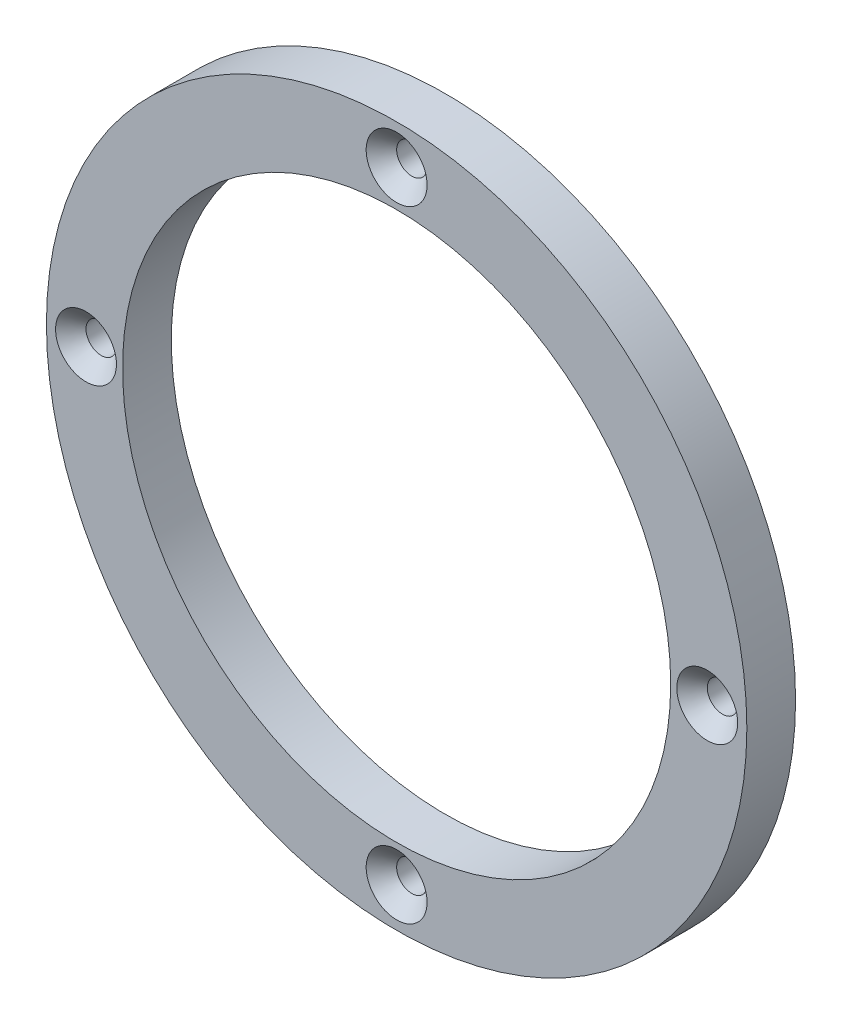
ISO-10303-21;
HEADER;
FILE_DESCRIPTION(('STEP AP214'),'2;1');
FILE_NAME('part.step','',(''),(''),'','','');
FILE_SCHEMA(('AUTOMOTIVE_DESIGN { 1 0 10303 214 1 1 1 1 }'));
ENDSEC;
DATA;
#1=APPLICATION_CONTEXT('core data for automotive mechanical design processes');
#2=APPLICATION_PROTOCOL_DEFINITION('international standard','automotive_design',2000,#1);
#3=PRODUCT_CONTEXT('',#1,'mechanical');
#4=PRODUCT('Part','Part','',(#3));
#5=PRODUCT_RELATED_PRODUCT_CATEGORY('part','',(#4));
#6=PRODUCT_DEFINITION_FORMATION('','',#4);
#7=PRODUCT_DEFINITION_CONTEXT('part definition',#1,'design');
#8=PRODUCT_DEFINITION('design','',#6,#7);
#9=PRODUCT_DEFINITION_SHAPE('','',#8);
#10=(LENGTH_UNIT() NAMED_UNIT(*) SI_UNIT(.MILLI.,.METRE.));
#11=(NAMED_UNIT(*) PLANE_ANGLE_UNIT() SI_UNIT($,.RADIAN.));
#12=(NAMED_UNIT(*) SI_UNIT($,.STERADIAN.) SOLID_ANGLE_UNIT());
#13=UNCERTAINTY_MEASURE_WITH_UNIT(LENGTH_MEASURE(1.E-05),#10,'distance_accuracy_value','');
#14=(GEOMETRIC_REPRESENTATION_CONTEXT(3) GLOBAL_UNCERTAINTY_ASSIGNED_CONTEXT((#13)) GLOBAL_UNIT_ASSIGNED_CONTEXT((#10,
#11,#12)) REPRESENTATION_CONTEXT('',''));
#15=CARTESIAN_POINT('',(0.,0.,0.));
#16=DIRECTION('',(0.,0.,1.));
#17=DIRECTION('',(1.,0.,0.));
#18=AXIS2_PLACEMENT_3D('',#15,#16,#17);
#19=CARTESIAN_POINT('',(0.,0.,8.));
#20=DIRECTION('',(0.,0.,1.));
#21=DIRECTION('',(1.,0.,0.));
#22=AXIS2_PLACEMENT_3D('',#19,#20,#21);
#23=PLANE('',#22);
#24=CARTESIAN_POINT('',(0.,0.,8.));
#25=DIRECTION('',(0.,0.,1.));
#26=DIRECTION('',(1.,0.,0.));
#27=AXIS2_PLACEMENT_3D('',#24,#25,#26);
#28=CIRCLE('',#27,45.);
#29=CARTESIAN_POINT('',(45.,0.,8.));
#30=VERTEX_POINT('',#29);
#31=EDGE_CURVE('E45',#30,#30,#28,.F.);
#32=ORIENTED_EDGE('',*,*,#31,.T.);
#33=EDGE_LOOP('',(#32));
#34=FACE_BOUND('',#33,.T.);
#35=CARTESIAN_POINT('',(0.,51.0000007599592,7.99999999998136));
#36=DIRECTION('',(0.,0.,1.));
#37=DIRECTION('',(1.,0.,0.));
#38=AXIS2_PLACEMENT_3D('',#35,#36,#37);
#39=CIRCLE('',#38,4.99999999999545);
#40=CARTESIAN_POINT('',(4.99999999999545,51.0000007599592,7.99999999998136));
#41=VERTEX_POINT('',#40);
#42=EDGE_CURVE('E18',#41,#41,#39,.F.);
#43=ORIENTED_EDGE('',*,*,#42,.T.);
#44=EDGE_LOOP('',(#43));
#45=FACE_BOUND('',#44,.T.);
#46=CARTESIAN_POINT('',(-51.0000007599592,0.,8.00000000000638));
#47=DIRECTION('',(0.,0.,1.));
#48=DIRECTION('',(1.,0.,0.));
#49=AXIS2_PLACEMENT_3D('',#46,#47,#48);
#50=CIRCLE('',#49,4.99999999999545);
#51=CARTESIAN_POINT('',(-46.0000007599638,0.,8.00000000000638));
#52=VERTEX_POINT('',#51);
#53=EDGE_CURVE('E56',#52,#52,#50,.F.);
#54=ORIENTED_EDGE('',*,*,#53,.T.);
#55=EDGE_LOOP('',(#54));
#56=FACE_BOUND('',#55,.T.);
#57=CARTESIAN_POINT('',(51.0000007599592,0.,8.00000000001317));
#58=DIRECTION('',(0.,0.,1.));
#59=DIRECTION('',(1.,0.,0.));
#60=AXIS2_PLACEMENT_3D('',#57,#58,#59);
#61=CIRCLE('',#60,4.99999999999545);
#62=CARTESIAN_POINT('',(56.0000007599547,0.,8.00000000001317));
#63=VERTEX_POINT('',#62);
#64=EDGE_CURVE('E51',#63,#63,#61,.F.);
#65=ORIENTED_EDGE('',*,*,#64,.T.);
#66=EDGE_LOOP('',(#65));
#67=FACE_BOUND('',#66,.T.);
#68=CARTESIAN_POINT('',(0.,-51.0000007599592,7.99999999998135));
#69=DIRECTION('',(0.,0.,1.));
#70=DIRECTION('',(1.,0.,0.));
#71=AXIS2_PLACEMENT_3D('',#68,#69,#70);
#72=CIRCLE('',#71,4.99999999999545);
#73=CARTESIAN_POINT('',(4.99999999999545,-51.0000007599592,7.99999999998135));
#74=VERTEX_POINT('',#73);
#75=EDGE_CURVE('E54',#74,#74,#72,.F.);
#76=ORIENTED_EDGE('',*,*,#75,.T.);
#77=EDGE_LOOP('',(#76));
#78=FACE_BOUND('',#77,.T.);
#79=CARTESIAN_POINT('',(0.,0.,8.));
#80=DIRECTION('',(0.,0.,1.));
#81=DIRECTION('',(1.,0.,0.));
#82=AXIS2_PLACEMENT_3D('',#79,#80,#81);
#83=CIRCLE('',#82,57.5);
#84=CARTESIAN_POINT('',(57.5,0.,8.));
#85=VERTEX_POINT('',#84);
#86=EDGE_CURVE('E48',#85,#85,#83,.F.);
#87=ORIENTED_EDGE('',*,*,#86,.F.);
#88=EDGE_LOOP('',(#87));
#89=FACE_BOUND('',#88,.T.);
#90=ADVANCED_FACE('F15',(#34,#45,#56,#67,#78,#89),#23,.T.);
#91=CARTESIAN_POINT('',(0.,51.0000007599592,7.99999999998136));
#92=DIRECTION('',(0.,0.,1.));
#93=DIRECTION('',(1.,0.,0.));
#94=AXIS2_PLACEMENT_3D('',#91,#92,#93);
#95=CONICAL_SURFACE('',#94,4.99999999999545,0.785398163397448);
#96=CARTESIAN_POINT('',(0.,51.0000007599592,5.5));
#97=DIRECTION('',(0.,0.,1.));
#98=DIRECTION('',(1.,0.,0.));
#99=AXIS2_PLACEMENT_3D('',#96,#97,#98);
#100=CIRCLE('',#99,2.5);
#101=CARTESIAN_POINT('',(2.5,51.0000007599592,5.5));
#102=VERTEX_POINT('',#101);
#103=EDGE_CURVE('E30',#102,#102,#100,.F.);
#104=ORIENTED_EDGE('',*,*,#103,.T.);
#105=EDGE_LOOP('',(#104));
#106=FACE_BOUND('',#105,.T.);
#107=ORIENTED_EDGE('',*,*,#42,.F.);
#108=EDGE_LOOP('',(#107));
#109=FACE_BOUND('',#108,.T.);
#110=ADVANCED_FACE('F64',(#106,#109),#95,.F.);
#111=CARTESIAN_POINT('',(-51.0000007599592,0.,8.0000000000382));
#112=DIRECTION('',(0.,0.,1.));
#113=DIRECTION('',(1.,0.,0.));
#114=AXIS2_PLACEMENT_3D('',#111,#112,#113);
#115=CONICAL_SURFACE('',#114,5.00000000002727,0.785398163397448);
#116=CARTESIAN_POINT('',(-51.0000007599592,0.,5.5));
#117=DIRECTION('',(0.,0.,1.));
#118=DIRECTION('',(1.,0.,0.));
#119=AXIS2_PLACEMENT_3D('',#116,#117,#118);
#120=CIRCLE('',#119,2.5);
#121=CARTESIAN_POINT('',(-48.5000007599592,0.,5.5));
#122=VERTEX_POINT('',#121);
#123=EDGE_CURVE('E127',#122,#122,#120,.F.);
#124=ORIENTED_EDGE('',*,*,#123,.T.);
#125=EDGE_LOOP('',(#124));
#126=FACE_BOUND('',#125,.T.);
#127=ORIENTED_EDGE('',*,*,#53,.F.);
#128=EDGE_LOOP('',(#127));
#129=FACE_BOUND('',#128,.T.);
#130=ADVANCED_FACE('F66',(#126,#129),#115,.F.);
#131=CARTESIAN_POINT('',(0.,-51.0000007599592,7.99999999998136));
#132=DIRECTION('',(0.,0.,1.));
#133=DIRECTION('',(1.,0.,0.));
#134=AXIS2_PLACEMENT_3D('',#131,#132,#133);
#135=CONICAL_SURFACE('',#134,4.99999999999546,0.785398163397448);
#136=CARTESIAN_POINT('',(0.,-51.0000007599592,5.5));
#137=DIRECTION('',(0.,0.,1.));
#138=DIRECTION('',(1.,0.,0.));
#139=AXIS2_PLACEMENT_3D('',#136,#137,#138);
#140=CIRCLE('',#139,2.5);
#141=CARTESIAN_POINT('',(2.49999999999999,-51.0000007599592,5.5));
#142=VERTEX_POINT('',#141);
#143=EDGE_CURVE('E120',#142,#142,#140,.F.);
#144=ORIENTED_EDGE('',*,*,#143,.T.);
#145=EDGE_LOOP('',(#144));
#146=FACE_BOUND('',#145,.T.);
#147=ORIENTED_EDGE('',*,*,#75,.F.);
#148=EDGE_LOOP('',(#147));
#149=FACE_BOUND('',#148,.T.);
#150=ADVANCED_FACE('F73',(#146,#149),#135,.F.);
#151=CARTESIAN_POINT('',(51.0000007599592,0.,7.99999999998136));
#152=DIRECTION('',(0.,0.,1.));
#153=DIRECTION('',(1.,0.,0.));
#154=AXIS2_PLACEMENT_3D('',#151,#152,#153);
#155=CONICAL_SURFACE('',#154,4.99999999996364,0.785398163397448);
#156=CARTESIAN_POINT('',(51.0000007599592,0.,5.5));
#157=DIRECTION('',(0.,0.,1.));
#158=DIRECTION('',(1.,0.,0.));
#159=AXIS2_PLACEMENT_3D('',#156,#157,#158);
#160=CIRCLE('',#159,2.5);
#161=CARTESIAN_POINT('',(53.5000007599592,0.,5.5));
#162=VERTEX_POINT('',#161);
#163=EDGE_CURVE('E44',#162,#162,#160,.F.);
#164=ORIENTED_EDGE('',*,*,#163,.T.);
#165=EDGE_LOOP('',(#164));
#166=FACE_BOUND('',#165,.T.);
#167=ORIENTED_EDGE('',*,*,#64,.F.);
#168=EDGE_LOOP('',(#167));
#169=FACE_BOUND('',#168,.T.);
#170=ADVANCED_FACE('F108',(#166,#169),#155,.F.);
#171=CARTESIAN_POINT('',(0.,0.,0.));
#172=DIRECTION('',(0.,0.,1.));
#173=DIRECTION('',(1.,0.,0.));
#174=AXIS2_PLACEMENT_3D('',#171,#172,#173);
#175=CYLINDRICAL_SURFACE('',#174,57.5);
#176=CARTESIAN_POINT('',(0.,0.,0.));
#177=DIRECTION('',(0.,0.,1.));
#178=DIRECTION('',(1.,0.,0.));
#179=AXIS2_PLACEMENT_3D('',#176,#177,#178);
#180=CIRCLE('',#179,57.5);
#181=CARTESIAN_POINT('',(57.5,0.,0.));
#182=VERTEX_POINT('',#181);
#183=EDGE_CURVE('E41',#182,#182,#180,.T.);
#184=ORIENTED_EDGE('',*,*,#183,.T.);
#185=EDGE_LOOP('',(#184));
#186=FACE_BOUND('',#185,.T.);
#187=ORIENTED_EDGE('',*,*,#86,.T.);
#188=EDGE_LOOP('',(#187));
#189=FACE_BOUND('',#188,.T.);
#190=ADVANCED_FACE('F104',(#186,#189),#175,.T.);
#191=CARTESIAN_POINT('',(0.,0.,0.));
#192=DIRECTION('',(0.,0.,1.));
#193=DIRECTION('',(1.,0.,0.));
#194=AXIS2_PLACEMENT_3D('',#191,#192,#193);
#195=CYLINDRICAL_SURFACE('',#194,45.);
#196=CARTESIAN_POINT('',(0.,0.,0.));
#197=DIRECTION('',(0.,0.,1.));
#198=DIRECTION('',(1.,0.,0.));
#199=AXIS2_PLACEMENT_3D('',#196,#197,#198);
#200=CIRCLE('',#199,45.);
#201=CARTESIAN_POINT('',(45.,0.,0.));
#202=VERTEX_POINT('',#201);
#203=EDGE_CURVE('E38',#202,#202,#200,.F.);
#204=ORIENTED_EDGE('',*,*,#203,.T.);
#205=EDGE_LOOP('',(#204));
#206=FACE_BOUND('',#205,.T.);
#207=ORIENTED_EDGE('',*,*,#31,.F.);
#208=EDGE_LOOP('',(#207));
#209=FACE_BOUND('',#208,.T.);
#210=ADVANCED_FACE('F100',(#206,#209),#195,.F.);
#211=CARTESIAN_POINT('',(0.,51.0000007599592,0.));
#212=DIRECTION('',(0.,0.,1.));
#213=DIRECTION('',(1.,0.,0.));
#214=AXIS2_PLACEMENT_3D('',#211,#212,#213);
#215=CYLINDRICAL_SURFACE('',#214,2.5);
#216=CARTESIAN_POINT('',(0.,51.0000007599592,0.));
#217=DIRECTION('',(0.,0.,1.));
#218=DIRECTION('',(1.,0.,0.));
#219=AXIS2_PLACEMENT_3D('',#216,#217,#218);
#220=CIRCLE('',#219,2.5);
#221=CARTESIAN_POINT('',(2.5,51.0000007599592,0.));
#222=VERTEX_POINT('',#221);
#223=EDGE_CURVE('E35',#222,#222,#220,.F.);
#224=ORIENTED_EDGE('',*,*,#223,.T.);
#225=EDGE_LOOP('',(#224));
#226=FACE_BOUND('',#225,.T.);
#227=ORIENTED_EDGE('',*,*,#103,.F.);
#228=EDGE_LOOP('',(#227));
#229=FACE_BOUND('',#228,.T.);
#230=ADVANCED_FACE('F96',(#226,#229),#215,.F.);
#231=CARTESIAN_POINT('',(-51.0000007599592,0.,0.));
#232=DIRECTION('',(0.,0.,1.));
#233=DIRECTION('',(1.,0.,0.));
#234=AXIS2_PLACEMENT_3D('',#231,#232,#233);
#235=CYLINDRICAL_SURFACE('',#234,2.5);
#236=CARTESIAN_POINT('',(-51.0000007599592,0.,0.));
#237=DIRECTION('',(0.,0.,1.));
#238=DIRECTION('',(1.,0.,0.));
#239=AXIS2_PLACEMENT_3D('',#236,#237,#238);
#240=CIRCLE('',#239,2.5);
#241=CARTESIAN_POINT('',(-48.5000007599592,0.,0.));
#242=VERTEX_POINT('',#241);
#243=EDGE_CURVE('E27',#242,#242,#240,.F.);
#244=ORIENTED_EDGE('',*,*,#243,.T.);
#245=EDGE_LOOP('',(#244));
#246=FACE_BOUND('',#245,.T.);
#247=ORIENTED_EDGE('',*,*,#123,.F.);
#248=EDGE_LOOP('',(#247));
#249=FACE_BOUND('',#248,.T.);
#250=ADVANCED_FACE('F92',(#246,#249),#235,.F.);
#251=CARTESIAN_POINT('',(0.,-51.0000007599592,0.));
#252=DIRECTION('',(0.,0.,1.));
#253=DIRECTION('',(1.,0.,0.));
#254=AXIS2_PLACEMENT_3D('',#251,#252,#253);
#255=CYLINDRICAL_SURFACE('',#254,2.5);
#256=CARTESIAN_POINT('',(0.,-51.0000007599592,0.));
#257=DIRECTION('',(0.,0.,1.));
#258=DIRECTION('',(1.,0.,0.));
#259=AXIS2_PLACEMENT_3D('',#256,#257,#258);
#260=CIRCLE('',#259,2.5);
#261=CARTESIAN_POINT('',(2.49999999999999,-51.0000007599592,0.));
#262=VERTEX_POINT('',#261);
#263=EDGE_CURVE('E22',#262,#262,#260,.F.);
#264=ORIENTED_EDGE('',*,*,#263,.T.);
#265=EDGE_LOOP('',(#264));
#266=FACE_BOUND('',#265,.T.);
#267=ORIENTED_EDGE('',*,*,#143,.F.);
#268=EDGE_LOOP('',(#267));
#269=FACE_BOUND('',#268,.T.);
#270=ADVANCED_FACE('F86',(#266,#269),#255,.F.);
#271=CARTESIAN_POINT('',(51.0000007599592,0.,0.));
#272=DIRECTION('',(0.,0.,1.));
#273=DIRECTION('',(1.,0.,0.));
#274=AXIS2_PLACEMENT_3D('',#271,#272,#273);
#275=CYLINDRICAL_SURFACE('',#274,2.5);
#276=CARTESIAN_POINT('',(51.0000007599592,0.,0.));
#277=DIRECTION('',(0.,0.,1.));
#278=DIRECTION('',(1.,0.,0.));
#279=AXIS2_PLACEMENT_3D('',#276,#277,#278);
#280=CIRCLE('',#279,2.5);
#281=CARTESIAN_POINT('',(53.5000007599592,0.,0.));
#282=VERTEX_POINT('',#281);
#283=EDGE_CURVE('E10',#282,#282,#280,.F.);
#284=ORIENTED_EDGE('',*,*,#283,.T.);
#285=EDGE_LOOP('',(#284));
#286=FACE_BOUND('',#285,.T.);
#287=ORIENTED_EDGE('',*,*,#163,.F.);
#288=EDGE_LOOP('',(#287));
#289=FACE_BOUND('',#288,.T.);
#290=ADVANCED_FACE('F80',(#286,#289),#275,.F.);
#291=CARTESIAN_POINT('',(0.,0.,0.));
#292=DIRECTION('',(0.,0.,1.));
#293=DIRECTION('',(1.,0.,0.));
#294=AXIS2_PLACEMENT_3D('',#291,#292,#293);
#295=PLANE('',#294);
#296=ORIENTED_EDGE('',*,*,#283,.F.);
#297=EDGE_LOOP('',(#296));
#298=FACE_BOUND('',#297,.T.);
#299=ORIENTED_EDGE('',*,*,#263,.F.);
#300=EDGE_LOOP('',(#299));
#301=FACE_BOUND('',#300,.T.);
#302=ORIENTED_EDGE('',*,*,#243,.F.);
#303=EDGE_LOOP('',(#302));
#304=FACE_BOUND('',#303,.T.);
#305=ORIENTED_EDGE('',*,*,#223,.F.);
#306=EDGE_LOOP('',(#305));
#307=FACE_BOUND('',#306,.T.);
#308=ORIENTED_EDGE('',*,*,#203,.F.);
#309=EDGE_LOOP('',(#308));
#310=FACE_BOUND('',#309,.T.);
#311=ORIENTED_EDGE('',*,*,#183,.F.);
#312=EDGE_LOOP('',(#311));
#313=FACE_BOUND('',#312,.T.);
#314=ADVANCED_FACE('F78',(#298,#301,#304,#307,#310,#313),#295,.F.);
#315=CLOSED_SHELL('',(#90,#110,#130,#150,#170,#190,#210,#230,#250,#270,#290,#314));
#316=MANIFOLD_SOLID_BREP('B1',#315);
#317=ADVANCED_BREP_SHAPE_REPRESENTATION('',(#18,#316),#14);
#318=SHAPE_DEFINITION_REPRESENTATION(#9,#317);
ENDSEC;
END-ISO-10303-21;
